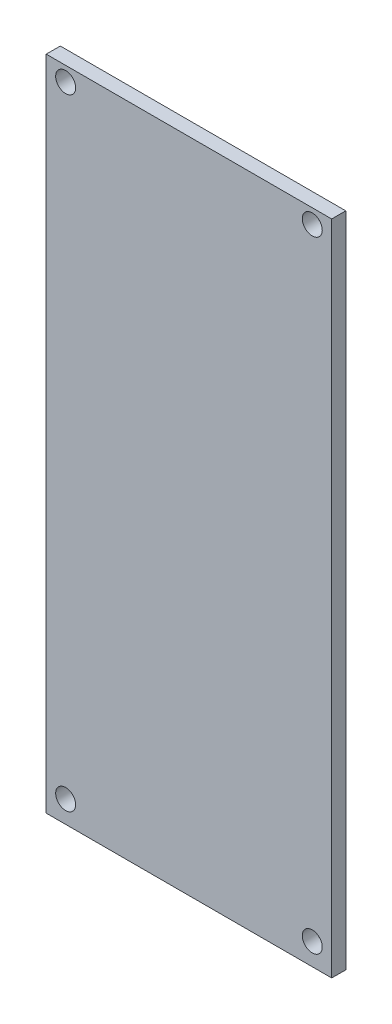
ISO-10303-21;
HEADER;
FILE_DESCRIPTION(('STEP AP214'),'2;1');
FILE_NAME('part.step','',(''),(''),'','','');
FILE_SCHEMA(('AUTOMOTIVE_DESIGN { 1 0 10303 214 1 1 1 1 }'));
ENDSEC;
DATA;
#1=APPLICATION_CONTEXT('core data for automotive mechanical design processes');
#2=APPLICATION_PROTOCOL_DEFINITION('international standard','automotive_design',2000,#1);
#3=PRODUCT_CONTEXT('',#1,'mechanical');
#4=PRODUCT('Part','Part','',(#3));
#5=PRODUCT_RELATED_PRODUCT_CATEGORY('part','',(#4));
#6=PRODUCT_DEFINITION_FORMATION('','',#4);
#7=PRODUCT_DEFINITION_CONTEXT('part definition',#1,'design');
#8=PRODUCT_DEFINITION('design','',#6,#7);
#9=PRODUCT_DEFINITION_SHAPE('','',#8);
#10=(LENGTH_UNIT() NAMED_UNIT(*) SI_UNIT(.MILLI.,.METRE.));
#11=(NAMED_UNIT(*) PLANE_ANGLE_UNIT() SI_UNIT($,.RADIAN.));
#12=(NAMED_UNIT(*) SI_UNIT($,.STERADIAN.) SOLID_ANGLE_UNIT());
#13=UNCERTAINTY_MEASURE_WITH_UNIT(LENGTH_MEASURE(1.E-05),#10,'distance_accuracy_value','');
#14=(GEOMETRIC_REPRESENTATION_CONTEXT(3) GLOBAL_UNCERTAINTY_ASSIGNED_CONTEXT((#13)) GLOBAL_UNIT_ASSIGNED_CONTEXT((#10,
#11,#12)) REPRESENTATION_CONTEXT('',''));
#15=CARTESIAN_POINT('',(0.,0.,0.));
#16=DIRECTION('',(0.,0.,1.));
#17=DIRECTION('',(1.,0.,0.));
#18=AXIS2_PLACEMENT_3D('',#15,#16,#17);
#19=CARTESIAN_POINT('',(0.,0.,1.5));
#20=DIRECTION('',(0.,0.,-1.));
#21=DIRECTION('',(-1.,0.,0.));
#22=AXIS2_PLACEMENT_3D('',#19,#20,#21);
#23=PLANE('',#22);
#24=DIRECTION('',(0.,1.,0.));
#25=VECTOR('',#24,1.);
#26=CARTESIAN_POINT('',(15.2,-35.4019003642237,1.5));
#27=LINE('',#26,#25);
#28=CARTESIAN_POINT('',(15.2,-35.4019003642237,1.5));
#29=VERTEX_POINT('',#28);
#30=CARTESIAN_POINT('',(15.2,34.5980996357763,1.5));
#31=VERTEX_POINT('',#30);
#32=EDGE_CURVE('E92',#29,#31,#27,.T.);
#33=ORIENTED_EDGE('',*,*,#32,.T.);
#34=DIRECTION('',(-1.,0.,0.));
#35=VECTOR('',#34,1.);
#36=CARTESIAN_POINT('',(-15.2,34.5980996357763,1.5));
#37=LINE('',#36,#35);
#38=CARTESIAN_POINT('',(-15.2,34.5980996357763,1.5));
#39=VERTEX_POINT('',#38);
#40=EDGE_CURVE('E87',#31,#39,#37,.T.);
#41=ORIENTED_EDGE('',*,*,#40,.T.);
#42=DIRECTION('',(0.,-1.,0.));
#43=VECTOR('',#42,1.);
#44=CARTESIAN_POINT('',(-15.2,-35.4019003642237,1.5));
#45=LINE('',#44,#43);
#46=CARTESIAN_POINT('',(-15.2,-35.4019003642237,1.5));
#47=VERTEX_POINT('',#46);
#48=EDGE_CURVE('E90',#39,#47,#45,.T.);
#49=ORIENTED_EDGE('',*,*,#48,.T.);
#50=DIRECTION('',(1.,0.,0.));
#51=VECTOR('',#50,1.);
#52=CARTESIAN_POINT('',(-15.2,-35.4019003642237,1.5));
#53=LINE('',#52,#51);
#54=EDGE_CURVE('E57',#47,#29,#53,.T.);
#55=ORIENTED_EDGE('',*,*,#54,.T.);
#56=EDGE_LOOP('',(#33,#41,#49,#55));
#57=FACE_BOUND('',#56,.T.);
#58=CARTESIAN_POINT('',(13.13,33.06,1.5));
#59=DIRECTION('',(0.,0.,1.));
#60=DIRECTION('',(1.,0.,0.));
#61=AXIS2_PLACEMENT_3D('',#58,#59,#60);
#62=CIRCLE('',#61,1.065);
#63=CARTESIAN_POINT('',(14.195,33.06,1.5));
#64=VERTEX_POINT('',#63);
#65=EDGE_CURVE('E112',#64,#64,#62,.T.);
#66=ORIENTED_EDGE('',*,*,#65,.F.);
#67=EDGE_LOOP('',(#66));
#68=FACE_BOUND('',#67,.T.);
#69=CARTESIAN_POINT('',(-13.13,33.06,1.5));
#70=DIRECTION('',(0.,0.,1.));
#71=DIRECTION('',(-1.,0.,0.));
#72=AXIS2_PLACEMENT_3D('',#69,#70,#71);
#73=CIRCLE('',#72,1.065);
#74=CARTESIAN_POINT('',(-14.195,33.06,1.5));
#75=VERTEX_POINT('',#74);
#76=EDGE_CURVE('E134',#75,#75,#73,.T.);
#77=ORIENTED_EDGE('',*,*,#76,.F.);
#78=EDGE_LOOP('',(#77));
#79=FACE_BOUND('',#78,.T.);
#80=CARTESIAN_POINT('',(-13.13,-33.06,1.5));
#81=DIRECTION('',(0.,0.,1.));
#82=DIRECTION('',(1.,0.,0.));
#83=AXIS2_PLACEMENT_3D('',#80,#81,#82);
#84=CIRCLE('',#83,1.06500000000002);
#85=CARTESIAN_POINT('',(-12.065,-33.06,1.5));
#86=VERTEX_POINT('',#85);
#87=EDGE_CURVE('E142',#86,#86,#84,.T.);
#88=ORIENTED_EDGE('',*,*,#87,.F.);
#89=EDGE_LOOP('',(#88));
#90=FACE_BOUND('',#89,.T.);
#91=CARTESIAN_POINT('',(13.13,-33.06,1.5));
#92=DIRECTION('',(0.,0.,1.));
#93=DIRECTION('',(-1.,0.,0.));
#94=AXIS2_PLACEMENT_3D('',#91,#92,#93);
#95=CIRCLE('',#94,1.06499999999997);
#96=CARTESIAN_POINT('',(12.065,-33.06,1.5));
#97=VERTEX_POINT('',#96);
#98=EDGE_CURVE('E150',#97,#97,#95,.T.);
#99=ORIENTED_EDGE('',*,*,#98,.F.);
#100=EDGE_LOOP('',(#99));
#101=FACE_BOUND('',#100,.T.);
#102=ADVANCED_FACE('F39',(#57,#68,#79,#90,#101),#23,.F.);
#103=CARTESIAN_POINT('',(0.,0.,0.));
#104=DIRECTION('',(0.,0.,-1.));
#105=DIRECTION('',(-1.,0.,0.));
#106=AXIS2_PLACEMENT_3D('',#103,#104,#105);
#107=PLANE('',#106);
#108=CARTESIAN_POINT('',(-13.13,-33.06,0.));
#109=DIRECTION('',(0.,0.,1.));
#110=DIRECTION('',(1.,0.,0.));
#111=AXIS2_PLACEMENT_3D('',#108,#109,#110);
#112=CIRCLE('',#111,1.06500000000002);
#113=CARTESIAN_POINT('',(-12.065,-33.06,0.));
#114=VERTEX_POINT('',#113);
#115=EDGE_CURVE('E146',#114,#114,#112,.T.);
#116=ORIENTED_EDGE('',*,*,#115,.T.);
#117=EDGE_LOOP('',(#116));
#118=FACE_BOUND('',#117,.T.);
#119=CARTESIAN_POINT('',(13.13,33.06,0.));
#120=DIRECTION('',(0.,0.,1.));
#121=DIRECTION('',(1.,0.,0.));
#122=AXIS2_PLACEMENT_3D('',#119,#120,#121);
#123=CIRCLE('',#122,1.065);
#124=CARTESIAN_POINT('',(14.195,33.06,0.));
#125=VERTEX_POINT('',#124);
#126=EDGE_CURVE('E130',#125,#125,#123,.T.);
#127=ORIENTED_EDGE('',*,*,#126,.T.);
#128=EDGE_LOOP('',(#127));
#129=FACE_BOUND('',#128,.T.);
#130=DIRECTION('',(0.,1.,0.));
#131=VECTOR('',#130,1.);
#132=CARTESIAN_POINT('',(15.2,-35.4019003642237,0.));
#133=LINE('',#132,#131);
#134=CARTESIAN_POINT('',(15.2,-35.4019003642237,0.));
#135=VERTEX_POINT('',#134);
#136=CARTESIAN_POINT('',(15.2,34.5980996357763,0.));
#137=VERTEX_POINT('',#136);
#138=EDGE_CURVE('E108',#135,#137,#133,.T.);
#139=ORIENTED_EDGE('',*,*,#138,.F.);
#140=DIRECTION('',(1.,0.,0.));
#141=VECTOR('',#140,1.);
#142=CARTESIAN_POINT('',(-15.2,-35.4019003642237,0.));
#143=LINE('',#142,#141);
#144=CARTESIAN_POINT('',(-15.2,-35.4019003642237,0.));
#145=VERTEX_POINT('',#144);
#146=EDGE_CURVE('E80',#145,#135,#143,.T.);
#147=ORIENTED_EDGE('',*,*,#146,.F.);
#148=DIRECTION('',(0.,-1.,0.));
#149=VECTOR('',#148,1.);
#150=CARTESIAN_POINT('',(-15.2,-35.4019003642237,0.));
#151=LINE('',#150,#149);
#152=CARTESIAN_POINT('',(-15.2,34.5980996357763,0.));
#153=VERTEX_POINT('',#152);
#154=EDGE_CURVE('E74',#153,#145,#151,.T.);
#155=ORIENTED_EDGE('',*,*,#154,.F.);
#156=DIRECTION('',(-1.,0.,0.));
#157=VECTOR('',#156,1.);
#158=CARTESIAN_POINT('',(-15.2,34.5980996357763,0.));
#159=LINE('',#158,#157);
#160=EDGE_CURVE('E97',#137,#153,#159,.T.);
#161=ORIENTED_EDGE('',*,*,#160,.F.);
#162=EDGE_LOOP('',(#139,#147,#155,#161));
#163=FACE_BOUND('',#162,.T.);
#164=CARTESIAN_POINT('',(-13.13,33.06,0.));
#165=DIRECTION('',(0.,0.,1.));
#166=DIRECTION('',(-1.,0.,0.));
#167=AXIS2_PLACEMENT_3D('',#164,#165,#166);
#168=CIRCLE('',#167,1.065);
#169=CARTESIAN_POINT('',(-14.195,33.06,0.));
#170=VERTEX_POINT('',#169);
#171=EDGE_CURVE('E138',#170,#170,#168,.T.);
#172=ORIENTED_EDGE('',*,*,#171,.T.);
#173=EDGE_LOOP('',(#172));
#174=FACE_BOUND('',#173,.T.);
#175=CARTESIAN_POINT('',(13.13,-33.06,0.));
#176=DIRECTION('',(0.,0.,1.));
#177=DIRECTION('',(-1.,0.,0.));
#178=AXIS2_PLACEMENT_3D('',#175,#176,#177);
#179=CIRCLE('',#178,1.06499999999997);
#180=CARTESIAN_POINT('',(12.065,-33.06,0.));
#181=VERTEX_POINT('',#180);
#182=EDGE_CURVE('E154',#181,#181,#179,.T.);
#183=ORIENTED_EDGE('',*,*,#182,.T.);
#184=EDGE_LOOP('',(#183));
#185=FACE_BOUND('',#184,.T.);
#186=ADVANCED_FACE('F125',(#118,#129,#163,#174,#185),#107,.T.);
#187=CARTESIAN_POINT('',(15.2,-35.4019003642237,1.5));
#188=DIRECTION('',(-1.,0.,0.));
#189=DIRECTION('',(0.,-1.,0.));
#190=AXIS2_PLACEMENT_3D('',#187,#188,#189);
#191=PLANE('',#190);
#192=ORIENTED_EDGE('',*,*,#138,.T.);
#193=DIRECTION('',(0.,0.,-1.));
#194=VECTOR('',#193,1.);
#195=CARTESIAN_POINT('',(15.2,34.5980996357763,1.5));
#196=LINE('',#195,#194);
#197=EDGE_CURVE('E11',#31,#137,#196,.T.);
#198=ORIENTED_EDGE('',*,*,#197,.F.);
#199=ORIENTED_EDGE('',*,*,#32,.F.);
#200=DIRECTION('',(0.,0.,-1.));
#201=VECTOR('',#200,1.);
#202=CARTESIAN_POINT('',(15.2,-35.4019003642237,1.5));
#203=LINE('',#202,#201);
#204=EDGE_CURVE('E104',#29,#135,#203,.T.);
#205=ORIENTED_EDGE('',*,*,#204,.T.);
#206=EDGE_LOOP('',(#192,#198,#199,#205));
#207=FACE_BOUND('',#206,.T.);
#208=ADVANCED_FACE('F41',(#207),#191,.F.);
#209=CARTESIAN_POINT('',(-15.2,34.5980996357763,1.5));
#210=DIRECTION('',(0.,-1.,0.));
#211=DIRECTION('',(0.,0.,-1.));
#212=AXIS2_PLACEMENT_3D('',#209,#210,#211);
#213=PLANE('',#212);
#214=ORIENTED_EDGE('',*,*,#160,.T.);
#215=DIRECTION('',(0.,0.,-1.));
#216=VECTOR('',#215,1.);
#217=CARTESIAN_POINT('',(-15.2,34.5980996357763,1.5));
#218=LINE('',#217,#216);
#219=EDGE_CURVE('E49',#39,#153,#218,.T.);
#220=ORIENTED_EDGE('',*,*,#219,.F.);
#221=ORIENTED_EDGE('',*,*,#40,.F.);
#222=ORIENTED_EDGE('',*,*,#197,.T.);
#223=EDGE_LOOP('',(#214,#220,#221,#222));
#224=FACE_BOUND('',#223,.T.);
#225=ADVANCED_FACE('F96',(#224),#213,.F.);
#226=CARTESIAN_POINT('',(-15.2,-35.4019003642237,1.5));
#227=DIRECTION('',(1.,0.,0.));
#228=DIRECTION('',(0.,1.,0.));
#229=AXIS2_PLACEMENT_3D('',#226,#227,#228);
#230=PLANE('',#229);
#231=ORIENTED_EDGE('',*,*,#154,.T.);
#232=DIRECTION('',(0.,0.,-1.));
#233=VECTOR('',#232,1.);
#234=CARTESIAN_POINT('',(-15.2,-35.4019003642237,1.5));
#235=LINE('',#234,#233);
#236=EDGE_CURVE('E99',#47,#145,#235,.T.);
#237=ORIENTED_EDGE('',*,*,#236,.F.);
#238=ORIENTED_EDGE('',*,*,#48,.F.);
#239=ORIENTED_EDGE('',*,*,#219,.T.);
#240=EDGE_LOOP('',(#231,#237,#238,#239));
#241=FACE_BOUND('',#240,.T.);
#242=ADVANCED_FACE('F100',(#241),#230,.F.);
#243=CARTESIAN_POINT('',(-15.2,-35.4019003642237,1.5));
#244=DIRECTION('',(0.,1.,0.));
#245=DIRECTION('',(0.,0.,1.));
#246=AXIS2_PLACEMENT_3D('',#243,#244,#245);
#247=PLANE('',#246);
#248=ORIENTED_EDGE('',*,*,#146,.T.);
#249=ORIENTED_EDGE('',*,*,#204,.F.);
#250=ORIENTED_EDGE('',*,*,#54,.F.);
#251=ORIENTED_EDGE('',*,*,#236,.T.);
#252=EDGE_LOOP('',(#248,#249,#250,#251));
#253=FACE_BOUND('',#252,.T.);
#254=ADVANCED_FACE('F122',(#253),#247,.F.);
#255=CARTESIAN_POINT('',(13.13,33.06,1.5));
#256=DIRECTION('',(0.,0.,-1.));
#257=DIRECTION('',(-1.,0.,0.));
#258=AXIS2_PLACEMENT_3D('',#255,#256,#257);
#259=CYLINDRICAL_SURFACE('',#258,1.065);
#260=ORIENTED_EDGE('',*,*,#65,.T.);
#261=EDGE_LOOP('',(#260));
#262=FACE_BOUND('',#261,.T.);
#263=ORIENTED_EDGE('',*,*,#126,.F.);
#264=EDGE_LOOP('',(#263));
#265=FACE_BOUND('',#264,.T.);
#266=ADVANCED_FACE('F173',(#262,#265),#259,.F.);
#267=CARTESIAN_POINT('',(-13.13,33.06,1.5));
#268=DIRECTION('',(0.,0.,-1.));
#269=DIRECTION('',(-1.,0.,0.));
#270=AXIS2_PLACEMENT_3D('',#267,#268,#269);
#271=CYLINDRICAL_SURFACE('',#270,1.065);
#272=ORIENTED_EDGE('',*,*,#76,.T.);
#273=EDGE_LOOP('',(#272));
#274=FACE_BOUND('',#273,.T.);
#275=ORIENTED_EDGE('',*,*,#171,.F.);
#276=EDGE_LOOP('',(#275));
#277=FACE_BOUND('',#276,.T.);
#278=ADVANCED_FACE('F219',(#274,#277),#271,.F.);
#279=CARTESIAN_POINT('',(-13.13,-33.06,1.5));
#280=DIRECTION('',(0.,0.,-1.));
#281=DIRECTION('',(-1.,0.,0.));
#282=AXIS2_PLACEMENT_3D('',#279,#280,#281);
#283=CYLINDRICAL_SURFACE('',#282,1.06500000000002);
#284=ORIENTED_EDGE('',*,*,#87,.T.);
#285=EDGE_LOOP('',(#284));
#286=FACE_BOUND('',#285,.T.);
#287=ORIENTED_EDGE('',*,*,#115,.F.);
#288=EDGE_LOOP('',(#287));
#289=FACE_BOUND('',#288,.T.);
#290=ADVANCED_FACE('F227',(#286,#289),#283,.F.);
#291=CARTESIAN_POINT('',(13.13,-33.06,1.5));
#292=DIRECTION('',(0.,0.,-1.));
#293=DIRECTION('',(-1.,0.,0.));
#294=AXIS2_PLACEMENT_3D('',#291,#292,#293);
#295=CYLINDRICAL_SURFACE('',#294,1.06499999999997);
#296=ORIENTED_EDGE('',*,*,#98,.T.);
#297=EDGE_LOOP('',(#296));
#298=FACE_BOUND('',#297,.T.);
#299=ORIENTED_EDGE('',*,*,#182,.F.);
#300=EDGE_LOOP('',(#299));
#301=FACE_BOUND('',#300,.T.);
#302=ADVANCED_FACE('F162',(#298,#301),#295,.F.);
#303=CLOSED_SHELL('',(#102,#186,#208,#225,#242,#254,#266,#278,#290,#302));
#304=MANIFOLD_SOLID_BREP('B2',#303);
#305=ADVANCED_BREP_SHAPE_REPRESENTATION('',(#18,#304),#14);
#306=SHAPE_DEFINITION_REPRESENTATION(#9,#305);
ENDSEC;
END-ISO-10303-21;
